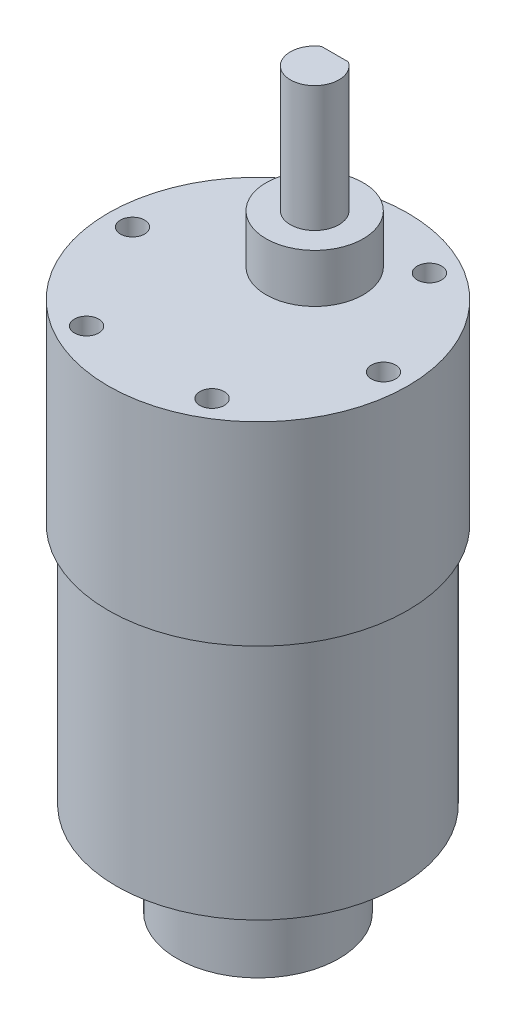
ISO-10303-21;
HEADER;
FILE_DESCRIPTION(('STEP AP214'),'2;1');
FILE_NAME('part.step','',(''),(''),'','','');
FILE_SCHEMA(('AUTOMOTIVE_DESIGN { 1 0 10303 214 1 1 1 1 }'));
ENDSEC;
DATA;
#1=APPLICATION_CONTEXT('core data for automotive mechanical design processes');
#2=APPLICATION_PROTOCOL_DEFINITION('international standard','automotive_design',2000,#1);
#3=PRODUCT_CONTEXT('',#1,'mechanical');
#4=PRODUCT('Part','Part','',(#3));
#5=PRODUCT_RELATED_PRODUCT_CATEGORY('part','',(#4));
#6=PRODUCT_DEFINITION_FORMATION('','',#4);
#7=PRODUCT_DEFINITION_CONTEXT('part definition',#1,'design');
#8=PRODUCT_DEFINITION('design','',#6,#7);
#9=PRODUCT_DEFINITION_SHAPE('','',#8);
#10=(LENGTH_UNIT() NAMED_UNIT(*) SI_UNIT(.MILLI.,.METRE.));
#11=(NAMED_UNIT(*) PLANE_ANGLE_UNIT() SI_UNIT($,.RADIAN.));
#12=(NAMED_UNIT(*) SI_UNIT($,.STERADIAN.) SOLID_ANGLE_UNIT());
#13=UNCERTAINTY_MEASURE_WITH_UNIT(LENGTH_MEASURE(1.E-05),#10,'distance_accuracy_value','');
#14=(GEOMETRIC_REPRESENTATION_CONTEXT(3) GLOBAL_UNCERTAINTY_ASSIGNED_CONTEXT((#13)) GLOBAL_UNIT_ASSIGNED_CONTEXT((#10,
#11,#12)) REPRESENTATION_CONTEXT('',''));
#15=CARTESIAN_POINT('',(0.,0.,0.));
#16=DIRECTION('',(0.,0.,1.));
#17=DIRECTION('',(1.,0.,0.));
#18=AXIS2_PLACEMENT_3D('',#15,#16,#17);
#19=CARTESIAN_POINT('',(0.,24.,0.));
#20=DIRECTION('',(0.,-1.,0.));
#21=DIRECTION('',(0.,0.,-1.));
#22=AXIS2_PLACEMENT_3D('',#19,#20,#21);
#23=CYLINDRICAL_SURFACE('',#22,18.5);
#24=CARTESIAN_POINT('',(0.,24.,0.));
#25=DIRECTION('',(0.,1.,0.));
#26=DIRECTION('',(0.,0.,1.));
#27=AXIS2_PLACEMENT_3D('',#24,#25,#26);
#28=CIRCLE('',#27,18.5);
#29=CARTESIAN_POINT('',(0.,24.,18.5));
#30=VERTEX_POINT('',#29);
#31=EDGE_CURVE('E87',#30,#30,#28,.T.);
#32=ORIENTED_EDGE('',*,*,#31,.F.);
#33=EDGE_LOOP('',(#32));
#34=FACE_BOUND('',#33,.T.);
#35=CARTESIAN_POINT('',(0.,0.,0.));
#36=DIRECTION('',(0.,1.,0.));
#37=DIRECTION('',(0.,0.,1.));
#38=AXIS2_PLACEMENT_3D('',#35,#36,#37);
#39=CIRCLE('',#38,18.5);
#40=CARTESIAN_POINT('',(0.,0.,18.5));
#41=VERTEX_POINT('',#40);
#42=EDGE_CURVE('E85',#41,#41,#39,.T.);
#43=ORIENTED_EDGE('',*,*,#42,.T.);
#44=EDGE_LOOP('',(#43));
#45=FACE_BOUND('',#44,.T.);
#46=ADVANCED_FACE('F35',(#34,#45),#23,.T.);
#47=CARTESIAN_POINT('',(0.,24.,0.));
#48=DIRECTION('',(0.,1.,0.));
#49=DIRECTION('',(0.,0.,1.));
#50=AXIS2_PLACEMENT_3D('',#47,#48,#49);
#51=PLANE('',#50);
#52=CARTESIAN_POINT('',(-7.75000000000016,24.,13.4233937586587));
#53=DIRECTION('',(0.,1.,0.));
#54=DIRECTION('',(0.,0.,1.));
#55=AXIS2_PLACEMENT_3D('',#52,#53,#54);
#56=CIRCLE('',#55,1.5);
#57=CARTESIAN_POINT('',(-7.75000000000016,24.,14.9233937586587));
#58=VERTEX_POINT('',#57);
#59=EDGE_CURVE('E203',#58,#58,#56,.T.);
#60=ORIENTED_EDGE('',*,*,#59,.F.);
#61=EDGE_LOOP('',(#60));
#62=FACE_BOUND('',#61,.T.);
#63=CARTESIAN_POINT('',(7.74999999999987,24.,13.4233937586589));
#64=DIRECTION('',(0.,1.,0.));
#65=DIRECTION('',(0.,0.,1.));
#66=AXIS2_PLACEMENT_3D('',#63,#64,#65);
#67=CIRCLE('',#66,1.5);
#68=CARTESIAN_POINT('',(7.74999999999987,24.,14.9233937586589));
#69=VERTEX_POINT('',#68);
#70=EDGE_CURVE('E202',#69,#69,#67,.T.);
#71=ORIENTED_EDGE('',*,*,#70,.F.);
#72=EDGE_LOOP('',(#71));
#73=FACE_BOUND('',#72,.T.);
#74=CARTESIAN_POINT('',(15.5,24.,1.08235921504137E-13));
#75=DIRECTION('',(0.,1.,0.));
#76=DIRECTION('',(0.,0.,1.));
#77=AXIS2_PLACEMENT_3D('',#74,#75,#76);
#78=CIRCLE('',#77,1.5);
#79=CARTESIAN_POINT('',(15.5,24.,1.50000000000011));
#80=VERTEX_POINT('',#79);
#81=EDGE_CURVE('E212',#80,#80,#78,.T.);
#82=ORIENTED_EDGE('',*,*,#81,.F.);
#83=EDGE_LOOP('',(#82));
#84=FACE_BOUND('',#83,.T.);
#85=CARTESIAN_POINT('',(7.75000000000006,24.,-13.4233937586588));
#86=DIRECTION('',(0.,1.,0.));
#87=DIRECTION('',(0.,0.,1.));
#88=AXIS2_PLACEMENT_3D('',#85,#86,#87);
#89=CIRCLE('',#88,1.5);
#90=CARTESIAN_POINT('',(7.75000000000006,24.,-11.9233937586588));
#91=VERTEX_POINT('',#90);
#92=EDGE_CURVE('E217',#91,#91,#89,.T.);
#93=ORIENTED_EDGE('',*,*,#92,.F.);
#94=EDGE_LOOP('',(#93));
#95=FACE_BOUND('',#94,.T.);
#96=CARTESIAN_POINT('',(-7.74999999999997,24.,-13.4233937586588));
#97=DIRECTION('',(0.,1.,0.));
#98=DIRECTION('',(0.,0.,1.));
#99=AXIS2_PLACEMENT_3D('',#96,#97,#98);
#100=CIRCLE('',#99,1.5);
#101=CARTESIAN_POINT('',(-7.74999999999997,24.,-11.9233937586588));
#102=VERTEX_POINT('',#101);
#103=EDGE_CURVE('E223',#102,#102,#100,.T.);
#104=ORIENTED_EDGE('',*,*,#103,.F.);
#105=EDGE_LOOP('',(#104));
#106=FACE_BOUND('',#105,.T.);
#107=CARTESIAN_POINT('',(-15.5,24.,0.));
#108=DIRECTION('',(0.,1.,0.));
#109=DIRECTION('',(0.,0.,1.));
#110=AXIS2_PLACEMENT_3D('',#107,#108,#109);
#111=CIRCLE('',#110,1.5);
#112=CARTESIAN_POINT('',(-15.5,24.,1.5));
#113=VERTEX_POINT('',#112);
#114=EDGE_CURVE('E229',#113,#113,#111,.T.);
#115=ORIENTED_EDGE('',*,*,#114,.F.);
#116=EDGE_LOOP('',(#115));
#117=FACE_BOUND('',#116,.T.);
#118=CARTESIAN_POINT('',(0.,24.,-7.));
#119=DIRECTION('',(0.,1.,0.));
#120=DIRECTION('',(0.,0.,1.));
#121=AXIS2_PLACEMENT_3D('',#118,#119,#120);
#122=CIRCLE('',#121,6.);
#123=CARTESIAN_POINT('',(0.,24.,-0.999999999999999));
#124=VERTEX_POINT('',#123);
#125=EDGE_CURVE('E72',#124,#124,#122,.T.);
#126=ORIENTED_EDGE('',*,*,#125,.F.);
#127=EDGE_LOOP('',(#126));
#128=FACE_BOUND('',#127,.T.);
#129=ORIENTED_EDGE('',*,*,#31,.T.);
#130=EDGE_LOOP('',(#129));
#131=FACE_BOUND('',#130,.T.);
#132=ADVANCED_FACE('F101',(#62,#73,#84,#95,#106,#117,#128,#131),#51,.T.);
#133=CARTESIAN_POINT('',(0.,0.,0.));
#134=DIRECTION('',(0.,1.,0.));
#135=DIRECTION('',(0.,0.,1.));
#136=AXIS2_PLACEMENT_3D('',#133,#134,#135);
#137=PLANE('',#136);
#138=CARTESIAN_POINT('',(0.,0.,0.));
#139=DIRECTION('',(0.,1.,0.));
#140=DIRECTION('',(0.,0.,1.));
#141=AXIS2_PLACEMENT_3D('',#138,#139,#140);
#142=CIRCLE('',#141,17.5);
#143=CARTESIAN_POINT('',(0.,0.,17.5));
#144=VERTEX_POINT('',#143);
#145=EDGE_CURVE('E63',#144,#144,#142,.F.);
#146=ORIENTED_EDGE('',*,*,#145,.F.);
#147=EDGE_LOOP('',(#146));
#148=FACE_BOUND('',#147,.T.);
#149=ORIENTED_EDGE('',*,*,#42,.F.);
#150=EDGE_LOOP('',(#149));
#151=FACE_BOUND('',#150,.T.);
#152=ADVANCED_FACE('F97',(#148,#151),#137,.F.);
#153=CARTESIAN_POINT('',(0.,30.,-7.));
#154=DIRECTION('',(0.,-1.,0.));
#155=DIRECTION('',(0.,0.,-1.));
#156=AXIS2_PLACEMENT_3D('',#153,#154,#155);
#157=CYLINDRICAL_SURFACE('',#156,6.);
#158=CARTESIAN_POINT('',(0.,30.,-7.));
#159=DIRECTION('',(0.,1.,0.));
#160=DIRECTION('',(0.,0.,1.));
#161=AXIS2_PLACEMENT_3D('',#158,#159,#160);
#162=CIRCLE('',#161,6.);
#163=CARTESIAN_POINT('',(0.,30.,-0.999999999999999));
#164=VERTEX_POINT('',#163);
#165=EDGE_CURVE('E76',#164,#164,#162,.T.);
#166=ORIENTED_EDGE('',*,*,#165,.F.);
#167=EDGE_LOOP('',(#166));
#168=FACE_BOUND('',#167,.T.);
#169=ORIENTED_EDGE('',*,*,#125,.T.);
#170=EDGE_LOOP('',(#169));
#171=FACE_BOUND('',#170,.T.);
#172=ADVANCED_FACE('F100',(#168,#171),#157,.T.);
#173=CARTESIAN_POINT('',(0.,30.,-7.));
#174=DIRECTION('',(0.,1.,0.));
#175=DIRECTION('',(0.,0.,1.));
#176=AXIS2_PLACEMENT_3D('',#173,#174,#175);
#177=PLANE('',#176);
#178=CARTESIAN_POINT('',(0.,30.,-7.));
#179=DIRECTION('',(0.,1.,0.));
#180=DIRECTION('',(0.,0.,1.));
#181=AXIS2_PLACEMENT_3D('',#178,#179,#180);
#182=CIRCLE('',#181,3.);
#183=CARTESIAN_POINT('',(0.,30.,-4.));
#184=VERTEX_POINT('',#183);
#185=EDGE_CURVE('E73',#184,#184,#182,.T.);
#186=ORIENTED_EDGE('',*,*,#185,.F.);
#187=EDGE_LOOP('',(#186));
#188=FACE_BOUND('',#187,.T.);
#189=ORIENTED_EDGE('',*,*,#165,.T.);
#190=EDGE_LOOP('',(#189));
#191=FACE_BOUND('',#190,.T.);
#192=ADVANCED_FACE('F120',(#188,#191),#177,.T.);
#193=CARTESIAN_POINT('',(0.,45.5,-7.));
#194=DIRECTION('',(0.,-1.,0.));
#195=DIRECTION('',(0.,0.,-1.));
#196=AXIS2_PLACEMENT_3D('',#193,#194,#195);
#197=CYLINDRICAL_SURFACE('',#196,3.);
#198=CARTESIAN_POINT('',(0.,45.5,-7.));
#199=DIRECTION('',(0.,1.,0.));
#200=DIRECTION('',(0.,0.,1.));
#201=AXIS2_PLACEMENT_3D('',#198,#199,#200);
#202=CIRCLE('',#201,3.);
#203=CARTESIAN_POINT('',(-1.6583123951777,45.5,-9.5));
#204=VERTEX_POINT('',#203);
#205=CARTESIAN_POINT('',(1.6583123951777,45.5,-9.5));
#206=VERTEX_POINT('',#205);
#207=EDGE_CURVE('E68',#204,#206,#202,.T.);
#208=ORIENTED_EDGE('',*,*,#207,.F.);
#209=DIRECTION('',(0.,-1.,0.));
#210=VECTOR('',#209,1.);
#211=CARTESIAN_POINT('',(-1.6583123951777,45.5,-9.5));
#212=LINE('',#211,#210);
#213=CARTESIAN_POINT('',(-1.6583123951777,33.5,-9.5));
#214=VERTEX_POINT('',#213);
#215=EDGE_CURVE('E49',#204,#214,#212,.T.);
#216=ORIENTED_EDGE('',*,*,#215,.T.);
#217=CARTESIAN_POINT('',(0.,33.5,-7.));
#218=DIRECTION('',(0.,1.,0.));
#219=DIRECTION('',(0.,0.,1.));
#220=AXIS2_PLACEMENT_3D('',#217,#218,#219);
#221=CIRCLE('',#220,3.);
#222=CARTESIAN_POINT('',(1.6583123951777,33.5,-9.5));
#223=VERTEX_POINT('',#222);
#224=EDGE_CURVE('E11',#223,#214,#221,.T.);
#225=ORIENTED_EDGE('',*,*,#224,.F.);
#226=DIRECTION('',(0.,-1.,0.));
#227=VECTOR('',#226,1.);
#228=CARTESIAN_POINT('',(1.6583123951777,45.5,-9.5));
#229=LINE('',#228,#227);
#230=EDGE_CURVE('E54',#223,#206,#229,.F.);
#231=ORIENTED_EDGE('',*,*,#230,.T.);
#232=EDGE_LOOP('',(#208,#216,#225,#231));
#233=FACE_BOUND('',#232,.T.);
#234=ORIENTED_EDGE('',*,*,#185,.T.);
#235=EDGE_LOOP('',(#234));
#236=FACE_BOUND('',#235,.T.);
#237=ADVANCED_FACE('F66',(#233,#236),#197,.T.);
#238=CARTESIAN_POINT('',(0.,45.5,-7.));
#239=DIRECTION('',(0.,1.,0.));
#240=DIRECTION('',(0.,0.,1.));
#241=AXIS2_PLACEMENT_3D('',#238,#239,#240);
#242=PLANE('',#241);
#243=DIRECTION('',(1.,0.,0.));
#244=VECTOR('',#243,1.);
#245=CARTESIAN_POINT('',(0.,45.5,-9.5));
#246=LINE('',#245,#244);
#247=EDGE_CURVE('E42',#204,#206,#246,.T.);
#248=ORIENTED_EDGE('',*,*,#247,.F.);
#249=ORIENTED_EDGE('',*,*,#207,.T.);
#250=EDGE_LOOP('',(#248,#249));
#251=FACE_BOUND('',#250,.T.);
#252=ADVANCED_FACE('F71',(#251),#242,.T.);
#253=CARTESIAN_POINT('',(0.,-30.,0.));
#254=DIRECTION('',(0.,1.,0.));
#255=DIRECTION('',(0.,0.,1.));
#256=AXIS2_PLACEMENT_3D('',#253,#254,#255);
#257=CYLINDRICAL_SURFACE('',#256,17.5);
#258=CARTESIAN_POINT('',(0.,-30.,0.));
#259=DIRECTION('',(0.,-1.,0.));
#260=DIRECTION('',(0.,0.,-1.));
#261=AXIS2_PLACEMENT_3D('',#258,#259,#260);
#262=CIRCLE('',#261,17.5);
#263=CARTESIAN_POINT('',(0.,-30.,-17.5));
#264=VERTEX_POINT('',#263);
#265=EDGE_CURVE('E79',#264,#264,#262,.T.);
#266=ORIENTED_EDGE('',*,*,#265,.F.);
#267=EDGE_LOOP('',(#266));
#268=FACE_BOUND('',#267,.T.);
#269=ORIENTED_EDGE('',*,*,#145,.T.);
#270=EDGE_LOOP('',(#269));
#271=FACE_BOUND('',#270,.T.);
#272=ADVANCED_FACE('F95',(#268,#271),#257,.T.);
#273=CARTESIAN_POINT('',(0.,-30.,0.));
#274=DIRECTION('',(0.,-1.,0.));
#275=DIRECTION('',(0.,0.,-1.));
#276=AXIS2_PLACEMENT_3D('',#273,#274,#275);
#277=PLANE('',#276);
#278=CARTESIAN_POINT('',(0.,-30.,0.));
#279=DIRECTION('',(0.,-1.,0.));
#280=DIRECTION('',(0.,0.,-1.));
#281=AXIS2_PLACEMENT_3D('',#278,#279,#280);
#282=CIRCLE('',#281,10.);
#283=CARTESIAN_POINT('',(0.,-30.,-10.));
#284=VERTEX_POINT('',#283);
#285=EDGE_CURVE('E239',#284,#284,#282,.T.);
#286=ORIENTED_EDGE('',*,*,#285,.F.);
#287=EDGE_LOOP('',(#286));
#288=FACE_BOUND('',#287,.T.);
#289=ORIENTED_EDGE('',*,*,#265,.T.);
#290=EDGE_LOOP('',(#289));
#291=FACE_BOUND('',#290,.T.);
#292=ADVANCED_FACE('F131',(#288,#291),#277,.T.);
#293=CARTESIAN_POINT('',(0.,-41.5,0.));
#294=DIRECTION('',(0.,1.,0.));
#295=DIRECTION('',(0.,0.,1.));
#296=AXIS2_PLACEMENT_3D('',#293,#294,#295);
#297=CYLINDRICAL_SURFACE('',#296,10.);
#298=CARTESIAN_POINT('',(0.,-41.5,0.));
#299=DIRECTION('',(0.,-1.,0.));
#300=DIRECTION('',(0.,0.,-1.));
#301=AXIS2_PLACEMENT_3D('',#298,#299,#300);
#302=CIRCLE('',#301,10.);
#303=CARTESIAN_POINT('',(0.,-41.5,-10.));
#304=VERTEX_POINT('',#303);
#305=EDGE_CURVE('E240',#304,#304,#302,.T.);
#306=ORIENTED_EDGE('',*,*,#305,.F.);
#307=EDGE_LOOP('',(#306));
#308=FACE_BOUND('',#307,.T.);
#309=ORIENTED_EDGE('',*,*,#285,.T.);
#310=EDGE_LOOP('',(#309));
#311=FACE_BOUND('',#310,.T.);
#312=ADVANCED_FACE('F135',(#308,#311),#297,.T.);
#313=CARTESIAN_POINT('',(0.,-41.5,0.));
#314=DIRECTION('',(0.,-1.,0.));
#315=DIRECTION('',(0.,0.,-1.));
#316=AXIS2_PLACEMENT_3D('',#313,#314,#315);
#317=PLANE('',#316);
#318=ORIENTED_EDGE('',*,*,#305,.T.);
#319=EDGE_LOOP('',(#318));
#320=FACE_BOUND('',#319,.T.);
#321=ADVANCED_FACE('F139',(#320),#317,.T.);
#322=CARTESIAN_POINT('',(0.194140113586106,33.5,-9.5));
#323=DIRECTION('',(0.,1.,0.));
#324=DIRECTION('',(0.,0.,1.));
#325=AXIS2_PLACEMENT_3D('',#322,#323,#324);
#326=PLANE('',#325);
#327=ORIENTED_EDGE('',*,*,#224,.T.);
#328=DIRECTION('',(1.,0.,0.));
#329=VECTOR('',#328,1.);
#330=CARTESIAN_POINT('',(-3.71127978918926,33.5,-9.5));
#331=LINE('',#330,#329);
#332=EDGE_CURVE('E69',#214,#223,#331,.T.);
#333=ORIENTED_EDGE('',*,*,#332,.T.);
#334=EDGE_LOOP('',(#327,#333));
#335=FACE_BOUND('',#334,.T.);
#336=ADVANCED_FACE('F143',(#335),#326,.T.);
#337=CARTESIAN_POINT('',(-3.71127978918926,33.5,-9.5));
#338=DIRECTION('',(0.,0.,1.));
#339=DIRECTION('',(1.,0.,0.));
#340=AXIS2_PLACEMENT_3D('',#337,#338,#339);
#341=PLANE('',#340);
#342=ORIENTED_EDGE('',*,*,#247,.T.);
#343=ORIENTED_EDGE('',*,*,#230,.F.);
#344=ORIENTED_EDGE('',*,*,#332,.F.);
#345=ORIENTED_EDGE('',*,*,#215,.F.);
#346=EDGE_LOOP('',(#342,#343,#344,#345));
#347=FACE_BOUND('',#346,.T.);
#348=ADVANCED_FACE('F59',(#347),#341,.F.);
#349=CARTESIAN_POINT('',(-15.5,14.,0.));
#350=DIRECTION('',(0.,1.,0.));
#351=DIRECTION('',(0.,0.,1.));
#352=AXIS2_PLACEMENT_3D('',#349,#350,#351);
#353=CYLINDRICAL_SURFACE('',#352,1.5);
#354=CARTESIAN_POINT('',(-15.5,14.,0.));
#355=DIRECTION('',(0.,1.,0.));
#356=DIRECTION('',(0.,0.,1.));
#357=AXIS2_PLACEMENT_3D('',#354,#355,#356);
#358=CIRCLE('',#357,1.5);
#359=CARTESIAN_POINT('',(-15.5,14.,1.5));
#360=VERTEX_POINT('',#359);
#361=EDGE_CURVE('E232',#360,#360,#358,.T.);
#362=ORIENTED_EDGE('',*,*,#361,.F.);
#363=EDGE_LOOP('',(#362));
#364=FACE_BOUND('',#363,.T.);
#365=ORIENTED_EDGE('',*,*,#114,.T.);
#366=EDGE_LOOP('',(#365));
#367=FACE_BOUND('',#366,.T.);
#368=ADVANCED_FACE('F147',(#364,#367),#353,.F.);
#369=CARTESIAN_POINT('',(-15.5,14.,0.));
#370=DIRECTION('',(0.,1.,0.));
#371=DIRECTION('',(0.,0.,1.));
#372=AXIS2_PLACEMENT_3D('',#369,#370,#371);
#373=PLANE('',#372);
#374=ORIENTED_EDGE('',*,*,#361,.T.);
#375=EDGE_LOOP('',(#374));
#376=FACE_BOUND('',#375,.T.);
#377=ADVANCED_FACE('F153',(#376),#373,.T.);
#378=CARTESIAN_POINT('',(-7.74999999999997,14.,-13.4233937586588));
#379=DIRECTION('',(0.,1.,0.));
#380=DIRECTION('',(0.,0.,1.));
#381=AXIS2_PLACEMENT_3D('',#378,#379,#380);
#382=CYLINDRICAL_SURFACE('',#381,1.5);
#383=CARTESIAN_POINT('',(-7.74999999999997,14.,-13.4233937586588));
#384=DIRECTION('',(0.,1.,0.));
#385=DIRECTION('',(0.,0.,1.));
#386=AXIS2_PLACEMENT_3D('',#383,#384,#385);
#387=CIRCLE('',#386,1.5);
#388=CARTESIAN_POINT('',(-7.74999999999997,14.,-11.9233937586588));
#389=VERTEX_POINT('',#388);
#390=EDGE_CURVE('E226',#389,#389,#387,.T.);
#391=ORIENTED_EDGE('',*,*,#390,.F.);
#392=EDGE_LOOP('',(#391));
#393=FACE_BOUND('',#392,.T.);
#394=ORIENTED_EDGE('',*,*,#103,.T.);
#395=EDGE_LOOP('',(#394));
#396=FACE_BOUND('',#395,.T.);
#397=ADVANCED_FACE('F157',(#393,#396),#382,.F.);
#398=CARTESIAN_POINT('',(-7.74999999999997,14.,-13.4233937586588));
#399=DIRECTION('',(0.,1.,0.));
#400=DIRECTION('',(0.,0.,1.));
#401=AXIS2_PLACEMENT_3D('',#398,#399,#400);
#402=PLANE('',#401);
#403=ORIENTED_EDGE('',*,*,#390,.T.);
#404=EDGE_LOOP('',(#403));
#405=FACE_BOUND('',#404,.T.);
#406=ADVANCED_FACE('F161',(#405),#402,.T.);
#407=CARTESIAN_POINT('',(7.75000000000006,14.,-13.4233937586588));
#408=DIRECTION('',(0.,1.,0.));
#409=DIRECTION('',(0.,0.,1.));
#410=AXIS2_PLACEMENT_3D('',#407,#408,#409);
#411=CYLINDRICAL_SURFACE('',#410,1.5);
#412=CARTESIAN_POINT('',(7.75000000000006,14.,-13.4233937586588));
#413=DIRECTION('',(0.,1.,0.));
#414=DIRECTION('',(0.,0.,1.));
#415=AXIS2_PLACEMENT_3D('',#412,#413,#414);
#416=CIRCLE('',#415,1.5);
#417=CARTESIAN_POINT('',(7.75000000000006,14.,-11.9233937586588));
#418=VERTEX_POINT('',#417);
#419=EDGE_CURVE('E220',#418,#418,#416,.T.);
#420=ORIENTED_EDGE('',*,*,#419,.F.);
#421=EDGE_LOOP('',(#420));
#422=FACE_BOUND('',#421,.T.);
#423=ORIENTED_EDGE('',*,*,#92,.T.);
#424=EDGE_LOOP('',(#423));
#425=FACE_BOUND('',#424,.T.);
#426=ADVANCED_FACE('F165',(#422,#425),#411,.F.);
#427=CARTESIAN_POINT('',(7.75000000000006,14.,-13.4233937586588));
#428=DIRECTION('',(0.,1.,0.));
#429=DIRECTION('',(0.,0.,1.));
#430=AXIS2_PLACEMENT_3D('',#427,#428,#429);
#431=PLANE('',#430);
#432=ORIENTED_EDGE('',*,*,#419,.T.);
#433=EDGE_LOOP('',(#432));
#434=FACE_BOUND('',#433,.T.);
#435=ADVANCED_FACE('F169',(#434),#431,.T.);
#436=CARTESIAN_POINT('',(15.5,14.,1.08235921504137E-13));
#437=DIRECTION('',(0.,1.,0.));
#438=DIRECTION('',(0.,0.,1.));
#439=AXIS2_PLACEMENT_3D('',#436,#437,#438);
#440=CYLINDRICAL_SURFACE('',#439,1.5);
#441=CARTESIAN_POINT('',(15.5,14.,1.08235921504137E-13));
#442=DIRECTION('',(0.,1.,0.));
#443=DIRECTION('',(0.,0.,1.));
#444=AXIS2_PLACEMENT_3D('',#441,#442,#443);
#445=CIRCLE('',#444,1.5);
#446=CARTESIAN_POINT('',(15.5,14.,1.50000000000011));
#447=VERTEX_POINT('',#446);
#448=EDGE_CURVE('E214',#447,#447,#445,.T.);
#449=ORIENTED_EDGE('',*,*,#448,.F.);
#450=EDGE_LOOP('',(#449));
#451=FACE_BOUND('',#450,.T.);
#452=ORIENTED_EDGE('',*,*,#81,.T.);
#453=EDGE_LOOP('',(#452));
#454=FACE_BOUND('',#453,.T.);
#455=ADVANCED_FACE('F173',(#451,#454),#440,.F.);
#456=CARTESIAN_POINT('',(15.5,14.,1.08235921504137E-13));
#457=DIRECTION('',(0.,1.,0.));
#458=DIRECTION('',(0.,0.,1.));
#459=AXIS2_PLACEMENT_3D('',#456,#457,#458);
#460=PLANE('',#459);
#461=ORIENTED_EDGE('',*,*,#448,.T.);
#462=EDGE_LOOP('',(#461));
#463=FACE_BOUND('',#462,.T.);
#464=ADVANCED_FACE('F177',(#463),#460,.T.);
#465=CARTESIAN_POINT('',(7.74999999999987,14.,13.4233937586589));
#466=DIRECTION('',(0.,1.,0.));
#467=DIRECTION('',(0.,0.,1.));
#468=AXIS2_PLACEMENT_3D('',#465,#466,#467);
#469=CYLINDRICAL_SURFACE('',#468,1.5);
#470=CARTESIAN_POINT('',(7.74999999999987,14.,13.4233937586589));
#471=DIRECTION('',(0.,1.,0.));
#472=DIRECTION('',(0.,0.,1.));
#473=AXIS2_PLACEMENT_3D('',#470,#471,#472);
#474=CIRCLE('',#473,1.5);
#475=CARTESIAN_POINT('',(7.74999999999987,14.,14.9233937586589));
#476=VERTEX_POINT('',#475);
#477=EDGE_CURVE('E206',#476,#476,#474,.T.);
#478=ORIENTED_EDGE('',*,*,#477,.F.);
#479=EDGE_LOOP('',(#478));
#480=FACE_BOUND('',#479,.T.);
#481=ORIENTED_EDGE('',*,*,#70,.T.);
#482=EDGE_LOOP('',(#481));
#483=FACE_BOUND('',#482,.T.);
#484=ADVANCED_FACE('F181',(#480,#483),#469,.F.);
#485=CARTESIAN_POINT('',(7.74999999999987,14.,13.4233937586589));
#486=DIRECTION('',(0.,1.,0.));
#487=DIRECTION('',(0.,0.,1.));
#488=AXIS2_PLACEMENT_3D('',#485,#486,#487);
#489=PLANE('',#488);
#490=ORIENTED_EDGE('',*,*,#477,.T.);
#491=EDGE_LOOP('',(#490));
#492=FACE_BOUND('',#491,.T.);
#493=ADVANCED_FACE('F185',(#492),#489,.T.);
#494=CARTESIAN_POINT('',(-7.75000000000016,14.,13.4233937586587));
#495=DIRECTION('',(0.,1.,0.));
#496=DIRECTION('',(0.,0.,1.));
#497=AXIS2_PLACEMENT_3D('',#494,#495,#496);
#498=CYLINDRICAL_SURFACE('',#497,1.5);
#499=CARTESIAN_POINT('',(-7.75000000000016,14.,13.4233937586587));
#500=DIRECTION('',(0.,1.,0.));
#501=DIRECTION('',(0.,0.,1.));
#502=AXIS2_PLACEMENT_3D('',#499,#500,#501);
#503=CIRCLE('',#502,1.5);
#504=CARTESIAN_POINT('',(-7.75000000000016,14.,14.9233937586587));
#505=VERTEX_POINT('',#504);
#506=EDGE_CURVE('E201',#505,#505,#503,.T.);
#507=ORIENTED_EDGE('',*,*,#506,.F.);
#508=EDGE_LOOP('',(#507));
#509=FACE_BOUND('',#508,.T.);
#510=ORIENTED_EDGE('',*,*,#59,.T.);
#511=EDGE_LOOP('',(#510));
#512=FACE_BOUND('',#511,.T.);
#513=ADVANCED_FACE('F189',(#509,#512),#498,.F.);
#514=CARTESIAN_POINT('',(-7.75000000000016,14.,13.4233937586587));
#515=DIRECTION('',(0.,1.,0.));
#516=DIRECTION('',(0.,0.,1.));
#517=AXIS2_PLACEMENT_3D('',#514,#515,#516);
#518=PLANE('',#517);
#519=ORIENTED_EDGE('',*,*,#506,.T.);
#520=EDGE_LOOP('',(#519));
#521=FACE_BOUND('',#520,.T.);
#522=ADVANCED_FACE('F193',(#521),#518,.T.);
#523=CLOSED_SHELL('',(#46,#132,#152,#172,#192,#237,#252,#272,#292,#312,#321,#336,#348,#368,#377,
#397,#406,#426,#435,#455,#464,#484,#493,#513,#522));
#524=MANIFOLD_SOLID_BREP('B2',#523);
#525=ADVANCED_BREP_SHAPE_REPRESENTATION('',(#18,#524),#14);
#526=SHAPE_DEFINITION_REPRESENTATION(#9,#525);
ENDSEC;
END-ISO-10303-21;
